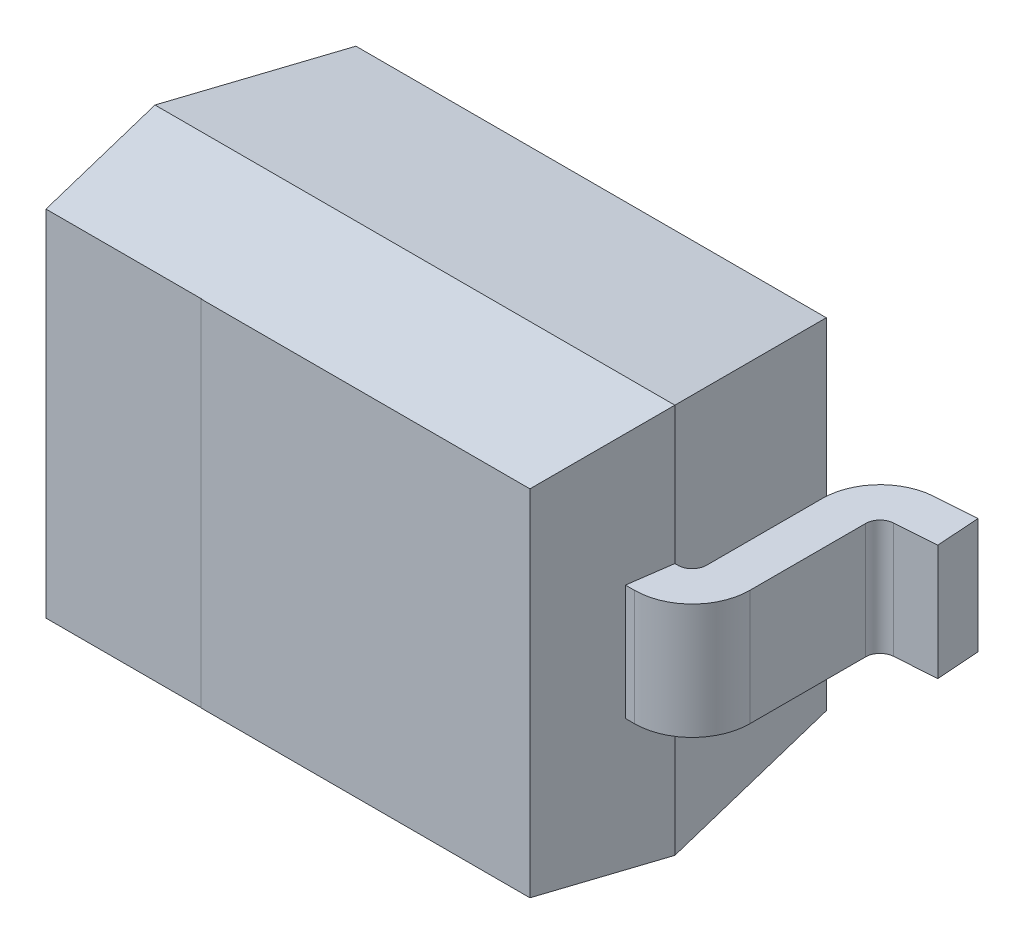
ISO-10303-21;
HEADER;
FILE_DESCRIPTION(('STEP AP214'),'2;1');
FILE_NAME('part.step','',(''),(''),'','','');
FILE_SCHEMA(('AUTOMOTIVE_DESIGN { 1 0 10303 214 1 1 1 1 }'));
ENDSEC;
DATA;
#1=APPLICATION_CONTEXT('core data for automotive mechanical design processes');
#2=APPLICATION_PROTOCOL_DEFINITION('international standard','automotive_design',2000,#1);
#3=PRODUCT_CONTEXT('',#1,'mechanical');
#4=PRODUCT('Part','Part','',(#3));
#5=PRODUCT_RELATED_PRODUCT_CATEGORY('part','',(#4));
#6=PRODUCT_DEFINITION_FORMATION('','',#4);
#7=PRODUCT_DEFINITION_CONTEXT('part definition',#1,'design');
#8=PRODUCT_DEFINITION('design','',#6,#7);
#9=PRODUCT_DEFINITION_SHAPE('','',#8);
#10=(LENGTH_UNIT() NAMED_UNIT(*) SI_UNIT(.MILLI.,.METRE.));
#11=(NAMED_UNIT(*) PLANE_ANGLE_UNIT() SI_UNIT($,.RADIAN.));
#12=(NAMED_UNIT(*) SI_UNIT($,.STERADIAN.) SOLID_ANGLE_UNIT());
#13=UNCERTAINTY_MEASURE_WITH_UNIT(LENGTH_MEASURE(1.E-05),#10,'distance_accuracy_value','');
#14=(GEOMETRIC_REPRESENTATION_CONTEXT(3) GLOBAL_UNCERTAINTY_ASSIGNED_CONTEXT((#13)) GLOBAL_UNIT_ASSIGNED_CONTEXT((#10,
#11,#12)) REPRESENTATION_CONTEXT('',''));
#15=CARTESIAN_POINT('',(0.,0.,0.));
#16=DIRECTION('',(0.,0.,1.));
#17=DIRECTION('',(1.,0.,0.));
#18=AXIS2_PLACEMENT_3D('',#15,#16,#17);
#19=CARTESIAN_POINT('',(0.838162032730946,2.5,1.1));
#20=DIRECTION('',(-0.99026806874157,0.,-0.139173100960069));
#21=DIRECTION('',(-0.139173100960069,0.,0.99026806874157));
#22=AXIS2_PLACEMENT_3D('',#19,#20,#21);
#23=PLANE('',#22);
#24=DIRECTION('',(0.139173100960069,0.,-0.99026806874157));
#25=VECTOR('',#24,1.);
#26=CARTESIAN_POINT('',(0.878918874794641,0.2,0.81));
#27=LINE('',#26,#25);
#28=CARTESIAN_POINT('',(0.878918874794641,0.2,0.81));
#29=VERTEX_POINT('',#28);
#30=CARTESIAN_POINT('',(0.9,0.2,0.66));
#31=VERTEX_POINT('',#30);
#32=EDGE_CURVE('E520',#29,#31,#27,.T.);
#33=ORIENTED_EDGE('',*,*,#32,.T.);
#34=DIRECTION('',(0.,-1.,0.));
#35=VECTOR('',#34,1.);
#36=CARTESIAN_POINT('',(0.9,2.5,0.66));
#37=LINE('',#36,#35);
#38=CARTESIAN_POINT('',(0.9,0.675,0.66));
#39=VERTEX_POINT('',#38);
#40=EDGE_CURVE('E310',#39,#31,#37,.T.);
#41=ORIENTED_EDGE('',*,*,#40,.F.);
#42=DIRECTION('',(0.137844537491632,0.137844537491632,-0.980814848463988));
#43=VECTOR('',#42,1.);
#44=CARTESIAN_POINT('',(0.87401406079437,0.64901406079437,0.844899565031451));
#45=LINE('',#44,#43);
#46=CARTESIAN_POINT('',(0.838162032730946,0.613162032730946,1.1));
#47=VERTEX_POINT('',#46);
#48=EDGE_CURVE('E333',#47,#39,#45,.T.);
#49=ORIENTED_EDGE('',*,*,#48,.F.);
#50=DIRECTION('',(0.,-1.,0.));
#51=VECTOR('',#50,1.);
#52=CARTESIAN_POINT('',(0.838162032730946,2.5,1.1));
#53=LINE('',#52,#51);
#54=CARTESIAN_POINT('',(0.838162032730946,-0.613162032730946,1.1));
#55=VERTEX_POINT('',#54);
#56=EDGE_CURVE('E314',#47,#55,#53,.T.);
#57=ORIENTED_EDGE('',*,*,#56,.T.);
#58=DIRECTION('',(-0.137844537491632,0.137844537491632,0.980814848463988));
#59=VECTOR('',#58,1.);
#60=CARTESIAN_POINT('',(0.77900847821296,-0.55400847821296,1.52089941078867));
#61=LINE('',#60,#59);
#62=CARTESIAN_POINT('',(0.9,-0.675,0.66));
#63=VERTEX_POINT('',#62);
#64=EDGE_CURVE('E270',#63,#55,#61,.T.);
#65=ORIENTED_EDGE('',*,*,#64,.F.);
#66=CARTESIAN_POINT('',(0.9,-0.2,0.66));
#67=VERTEX_POINT('',#66);
#68=EDGE_CURVE('E309',#67,#63,#37,.T.);
#69=ORIENTED_EDGE('',*,*,#68,.F.);
#70=DIRECTION('',(0.139173100960069,0.,-0.99026806874157));
#71=VECTOR('',#70,1.);
#72=CARTESIAN_POINT('',(0.878918874794641,-0.2,0.81));
#73=LINE('',#72,#71);
#74=CARTESIAN_POINT('',(0.878918874794641,-0.2,0.81));
#75=VERTEX_POINT('',#74);
#76=EDGE_CURVE('E63',#75,#67,#73,.T.);
#77=ORIENTED_EDGE('',*,*,#76,.F.);
#78=DIRECTION('',(0.,-1.,0.));
#79=VECTOR('',#78,1.);
#80=CARTESIAN_POINT('',(0.878918874794641,0.2,0.81));
#81=LINE('',#80,#79);
#82=EDGE_CURVE('E517',#29,#75,#81,.T.);
#83=ORIENTED_EDGE('',*,*,#82,.F.);
#84=EDGE_LOOP('',(#33,#41,#49,#57,#65,#69,#77,#83));
#85=FACE_BOUND('',#84,.T.);
#86=ADVANCED_FACE('F39',(#85),#23,.F.);
#87=CARTESIAN_POINT('',(-0.9,2.5,0.66));
#88=DIRECTION('',(0.99026806874157,0.,-0.139173100960069));
#89=DIRECTION('',(-0.139173100960069,0.,-0.99026806874157));
#90=AXIS2_PLACEMENT_3D('',#87,#88,#89);
#91=PLANE('',#90);
#92=DIRECTION('',(-0.137844537491632,-0.137844537491632,-0.980814848463988));
#93=VECTOR('',#92,1.);
#94=CARTESIAN_POINT('',(-0.839671455060805,-0.614671455060804,1.08925990205583));
#95=LINE('',#94,#93);
#96=CARTESIAN_POINT('',(-0.838302573565649,-0.613302573565648,1.099));
#97=VERTEX_POINT('',#96);
#98=CARTESIAN_POINT('',(-0.9,-0.675,0.66));
#99=VERTEX_POINT('',#98);
#100=EDGE_CURVE('E302',#97,#99,#95,.T.);
#101=ORIENTED_EDGE('',*,*,#100,.F.);
#102=DIRECTION('',(0.,1.,0.));
#103=VECTOR('',#102,1.);
#104=CARTESIAN_POINT('',(-0.838302573565648,2.5,1.099));
#105=LINE('',#104,#103);
#106=CARTESIAN_POINT('',(-0.838302573565648,0.613302573565648,1.099));
#107=VERTEX_POINT('',#106);
#108=EDGE_CURVE('E55',#97,#107,#105,.T.);
#109=ORIENTED_EDGE('',*,*,#108,.T.);
#110=DIRECTION('',(0.137844537491632,-0.137844537491632,0.980814848463988));
#111=VECTOR('',#110,1.);
#112=CARTESIAN_POINT('',(-0.934677037642215,0.709677037642215,0.413260056298615));
#113=LINE('',#112,#111);
#114=CARTESIAN_POINT('',(-0.9,0.675,0.66));
#115=VERTEX_POINT('',#114);
#116=EDGE_CURVE('E298',#115,#107,#113,.T.);
#117=ORIENTED_EDGE('',*,*,#116,.F.);
#118=DIRECTION('',(0.,-1.,0.));
#119=VECTOR('',#118,1.);
#120=CARTESIAN_POINT('',(-0.9,2.5,0.66));
#121=LINE('',#120,#119);
#122=CARTESIAN_POINT('',(-0.9,0.2,0.66));
#123=VERTEX_POINT('',#122);
#124=EDGE_CURVE('E318',#115,#123,#121,.T.);
#125=ORIENTED_EDGE('',*,*,#124,.T.);
#126=DIRECTION('',(-0.139173100960069,0.,-0.99026806874157));
#127=VECTOR('',#126,1.);
#128=CARTESIAN_POINT('',(-0.878918874794641,0.2,0.81));
#129=LINE('',#128,#127);
#130=CARTESIAN_POINT('',(-0.878918874794641,0.2,0.81));
#131=VERTEX_POINT('',#130);
#132=EDGE_CURVE('E480',#131,#123,#129,.T.);
#133=ORIENTED_EDGE('',*,*,#132,.F.);
#134=DIRECTION('',(0.,-1.,0.));
#135=VECTOR('',#134,1.);
#136=CARTESIAN_POINT('',(-0.878918874794641,0.2,0.81));
#137=LINE('',#136,#135);
#138=CARTESIAN_POINT('',(-0.878918874794641,-0.2,0.81));
#139=VERTEX_POINT('',#138);
#140=EDGE_CURVE('E291',#131,#139,#137,.T.);
#141=ORIENTED_EDGE('',*,*,#140,.T.);
#142=DIRECTION('',(-0.139173100960069,0.,-0.99026806874157));
#143=VECTOR('',#142,1.);
#144=CARTESIAN_POINT('',(-0.878918874794641,-0.2,0.81));
#145=LINE('',#144,#143);
#146=CARTESIAN_POINT('',(-0.9,-0.2,0.66));
#147=VERTEX_POINT('',#146);
#148=EDGE_CURVE('E352',#139,#147,#145,.T.);
#149=ORIENTED_EDGE('',*,*,#148,.T.);
#150=EDGE_CURVE('E317',#147,#99,#121,.T.);
#151=ORIENTED_EDGE('',*,*,#150,.T.);
#152=EDGE_LOOP('',(#101,#109,#117,#125,#133,#141,#149,#151));
#153=FACE_BOUND('',#152,.T.);
#154=ADVANCED_FACE('F346',(#153),#91,.F.);
#155=CARTESIAN_POINT('',(0.814270090831543,2.5,0.0500000000000002));
#156=DIRECTION('',(0.,0.,1.));
#157=DIRECTION('',(1.,0.,0.));
#158=AXIS2_PLACEMENT_3D('',#155,#156,#157);
#159=PLANE('',#158);
#160=DIRECTION('',(1.,0.,0.));
#161=VECTOR('',#160,1.);
#162=CARTESIAN_POINT('',(-0.9,-0.589270090831543,0.0500000000000002));
#163=LINE('',#162,#161);
#164=CARTESIAN_POINT('',(-0.814270090831543,-0.589270090831544,0.0500000000000002));
#165=VERTEX_POINT('',#164);
#166=CARTESIAN_POINT('',(0.814270090831543,-0.589270090831544,0.0500000000000002));
#167=VERTEX_POINT('',#166);
#168=EDGE_CURVE('E278',#165,#167,#163,.T.);
#169=ORIENTED_EDGE('',*,*,#168,.F.);
#170=DIRECTION('',(0.,-1.,0.));
#171=VECTOR('',#170,1.);
#172=CARTESIAN_POINT('',(-0.814270090831543,2.5,0.0500000000000002));
#173=LINE('',#172,#171);
#174=CARTESIAN_POINT('',(-0.814270090831543,0.589270090831543,0.0500000000000002));
#175=VERTEX_POINT('',#174);
#176=EDGE_CURVE('E322',#175,#165,#173,.T.);
#177=ORIENTED_EDGE('',*,*,#176,.F.);
#178=DIRECTION('',(1.,0.,0.));
#179=VECTOR('',#178,1.);
#180=CARTESIAN_POINT('',(-0.9,0.589270090831543,0.0500000000000002));
#181=LINE('',#180,#179);
#182=CARTESIAN_POINT('',(0.814270090831543,0.589270090831543,0.0500000000000002));
#183=VERTEX_POINT('',#182);
#184=EDGE_CURVE('E287',#175,#183,#181,.T.);
#185=ORIENTED_EDGE('',*,*,#184,.T.);
#186=DIRECTION('',(0.,-1.,0.));
#187=VECTOR('',#186,1.);
#188=CARTESIAN_POINT('',(0.814270090831543,2.5,0.0500000000000002));
#189=LINE('',#188,#187);
#190=EDGE_CURVE('E305',#183,#167,#189,.T.);
#191=ORIENTED_EDGE('',*,*,#190,.T.);
#192=EDGE_LOOP('',(#169,#177,#185,#191));
#193=FACE_BOUND('',#192,.T.);
#194=ADVANCED_FACE('F41',(#193),#159,.F.);
#195=CARTESIAN_POINT('',(-0.814270090831543,2.5,0.0500000000000002));
#196=DIRECTION('',(0.990268068741571,0.,0.139173100960062));
#197=DIRECTION('',(0.139173100960062,0.,-0.990268068741571));
#198=AXIS2_PLACEMENT_3D('',#195,#196,#197);
#199=PLANE('',#198);
#200=DIRECTION('',(0.137844537491625,0.137844537491625,-0.98081484846399));
#201=VECTOR('',#200,1.);
#202=CARTESIAN_POINT('',(-0.755570509885394,-0.530570509885394,-0.367669220980882));
#203=LINE('',#202,#201);
#204=EDGE_CURVE('E295',#99,#165,#203,.T.);
#205=ORIENTED_EDGE('',*,*,#204,.F.);
#206=ORIENTED_EDGE('',*,*,#150,.F.);
#207=DIRECTION('',(0.,-1.,0.));
#208=VECTOR('',#207,1.);
#209=CARTESIAN_POINT('',(-0.9,0.2,0.66));
#210=LINE('',#209,#208);
#211=EDGE_CURVE('E372',#123,#147,#210,.T.);
#212=ORIENTED_EDGE('',*,*,#211,.F.);
#213=ORIENTED_EDGE('',*,*,#124,.F.);
#214=DIRECTION('',(-0.137844537491625,0.137844537491625,0.98081484846399));
#215=VECTOR('',#214,1.);
#216=CARTESIAN_POINT('',(-0.850576092466794,0.625576092466795,0.308330624776304));
#217=LINE('',#216,#215);
#218=EDGE_CURVE('E292',#175,#115,#217,.T.);
#219=ORIENTED_EDGE('',*,*,#218,.F.);
#220=ORIENTED_EDGE('',*,*,#176,.T.);
#221=EDGE_LOOP('',(#205,#206,#212,#213,#219,#220));
#222=FACE_BOUND('',#221,.T.);
#223=ADVANCED_FACE('F361',(#222),#199,.F.);
#224=CARTESIAN_POINT('',(-0.838162032730946,2.5,1.1));
#225=DIRECTION('',(0.,0.,-1.));
#226=DIRECTION('',(-1.,0.,0.));
#227=AXIS2_PLACEMENT_3D('',#224,#225,#226);
#228=PLANE('',#227);
#229=DIRECTION('',(1.,0.,0.));
#230=VECTOR('',#229,1.);
#231=CARTESIAN_POINT('',(-0.9,0.613162032730946,1.1));
#232=LINE('',#231,#230);
#233=CARTESIAN_POINT('',(-0.3,0.613162032730946,1.1));
#234=VERTEX_POINT('',#233);
#235=EDGE_CURVE('E264',#234,#47,#232,.T.);
#236=ORIENTED_EDGE('',*,*,#235,.F.);
#237=DIRECTION('',(0.,1.,0.));
#238=VECTOR('',#237,1.);
#239=CARTESIAN_POINT('',(-0.3,0.675,1.1));
#240=LINE('',#239,#238);
#241=CARTESIAN_POINT('',(-0.3,-0.613162032730946,1.1));
#242=VERTEX_POINT('',#241);
#243=EDGE_CURVE('E252',#242,#234,#240,.T.);
#244=ORIENTED_EDGE('',*,*,#243,.F.);
#245=DIRECTION('',(1.,0.,0.));
#246=VECTOR('',#245,1.);
#247=CARTESIAN_POINT('',(-0.9,-0.613162032730946,1.1));
#248=LINE('',#247,#246);
#249=EDGE_CURVE('E262',#242,#55,#248,.T.);
#250=ORIENTED_EDGE('',*,*,#249,.T.);
#251=ORIENTED_EDGE('',*,*,#56,.F.);
#252=EDGE_LOOP('',(#236,#244,#250,#251));
#253=FACE_BOUND('',#252,.T.);
#254=ADVANCED_FACE('F260',(#253),#228,.F.);
#255=CARTESIAN_POINT('',(0.9,2.5,0.66));
#256=DIRECTION('',(-0.990268068741571,0.,0.139173100960062));
#257=DIRECTION('',(0.139173100960062,0.,0.990268068741571));
#258=AXIS2_PLACEMENT_3D('',#255,#256,#257);
#259=PLANE('',#258);
#260=DIRECTION('',(0.137844537491625,-0.137844537491625,0.98081484846399));
#261=VECTOR('',#260,1.);
#262=CARTESIAN_POINT('',(0.839671455060811,-0.614671455060811,0.230740097944187));
#263=LINE('',#262,#261);
#264=EDGE_CURVE('E329',#167,#63,#263,.T.);
#265=ORIENTED_EDGE('',*,*,#264,.F.);
#266=ORIENTED_EDGE('',*,*,#190,.F.);
#267=DIRECTION('',(-0.137844537491625,-0.137844537491625,-0.98081484846399));
#268=VECTOR('',#267,1.);
#269=CARTESIAN_POINT('',(0.934677037642211,0.709677037642211,0.906739943701373));
#270=LINE('',#269,#268);
#271=EDGE_CURVE('E326',#39,#183,#270,.T.);
#272=ORIENTED_EDGE('',*,*,#271,.F.);
#273=ORIENTED_EDGE('',*,*,#40,.T.);
#274=DIRECTION('',(0.,-1.,0.));
#275=VECTOR('',#274,1.);
#276=CARTESIAN_POINT('',(0.9,0.2,0.66));
#277=LINE('',#276,#275);
#278=EDGE_CURVE('E513',#31,#67,#277,.T.);
#279=ORIENTED_EDGE('',*,*,#278,.T.);
#280=ORIENTED_EDGE('',*,*,#68,.T.);
#281=EDGE_LOOP('',(#265,#266,#272,#273,#279,#280));
#282=FACE_BOUND('',#281,.T.);
#283=ADVANCED_FACE('F700',(#282),#259,.F.);
#284=CARTESIAN_POINT('',(-0.9,0.675,0.66));
#285=DIRECTION('',(0.,0.990268068741571,-0.139173100960062));
#286=DIRECTION('',(0.,0.139173100960062,0.990268068741571));
#287=AXIS2_PLACEMENT_3D('',#284,#285,#286);
#288=PLANE('',#287);
#289=ORIENTED_EDGE('',*,*,#218,.T.);
#290=DIRECTION('',(1.,0.,0.));
#291=VECTOR('',#290,1.);
#292=CARTESIAN_POINT('',(-0.9,0.675,0.66));
#293=LINE('',#292,#291);
#294=EDGE_CURVE('E281',#115,#39,#293,.T.);
#295=ORIENTED_EDGE('',*,*,#294,.T.);
#296=ORIENTED_EDGE('',*,*,#271,.T.);
#297=ORIENTED_EDGE('',*,*,#184,.F.);
#298=EDGE_LOOP('',(#289,#295,#296,#297));
#299=FACE_BOUND('',#298,.T.);
#300=ADVANCED_FACE('F734',(#299),#288,.T.);
#301=CARTESIAN_POINT('',(-0.9,0.613162032730946,1.1));
#302=DIRECTION('',(0.,0.99026806874157,0.139173100960069));
#303=DIRECTION('',(0.,-0.139173100960069,0.99026806874157));
#304=AXIS2_PLACEMENT_3D('',#301,#302,#303);
#305=PLANE('',#304);
#306=DIRECTION('',(0.,0.139173100960069,-0.99026806874157));
#307=VECTOR('',#306,1.);
#308=CARTESIAN_POINT('',(-0.3,0.613162032730946,1.1));
#309=LINE('',#308,#307);
#310=CARTESIAN_POINT('',(-0.3,0.613302573565648,1.099));
#311=VERTEX_POINT('',#310);
#312=EDGE_CURVE('E566',#234,#311,#309,.T.);
#313=ORIENTED_EDGE('',*,*,#312,.F.);
#314=ORIENTED_EDGE('',*,*,#235,.T.);
#315=ORIENTED_EDGE('',*,*,#48,.T.);
#316=ORIENTED_EDGE('',*,*,#294,.F.);
#317=ORIENTED_EDGE('',*,*,#116,.T.);
#318=DIRECTION('',(-1.,0.,0.));
#319=VECTOR('',#318,1.);
#320=CARTESIAN_POINT('',(-0.9,0.613302573565648,1.099));
#321=LINE('',#320,#319);
#322=EDGE_CURVE('E614',#311,#107,#321,.T.);
#323=ORIENTED_EDGE('',*,*,#322,.F.);
#324=EDGE_LOOP('',(#313,#314,#315,#316,#317,#323));
#325=FACE_BOUND('',#324,.T.);
#326=ADVANCED_FACE('F621',(#325),#305,.T.);
#327=CARTESIAN_POINT('',(-0.9,-0.675,0.66));
#328=DIRECTION('',(0.,-0.99026806874157,0.139173100960069));
#329=DIRECTION('',(0.,-0.139173100960069,-0.99026806874157));
#330=AXIS2_PLACEMENT_3D('',#327,#328,#329);
#331=PLANE('',#330);
#332=DIRECTION('',(0.,0.139173100960069,0.99026806874157));
#333=VECTOR('',#332,1.);
#334=CARTESIAN_POINT('',(-0.3,-0.675,0.66));
#335=LINE('',#334,#333);
#336=CARTESIAN_POINT('',(-0.3,-0.613302573565648,1.099));
#337=VERTEX_POINT('',#336);
#338=EDGE_CURVE('E12',#337,#242,#335,.T.);
#339=ORIENTED_EDGE('',*,*,#338,.F.);
#340=DIRECTION('',(1.,0.,0.));
#341=VECTOR('',#340,1.);
#342=CARTESIAN_POINT('',(-0.9,-0.613302573565648,1.099));
#343=LINE('',#342,#341);
#344=EDGE_CURVE('E48',#97,#337,#343,.T.);
#345=ORIENTED_EDGE('',*,*,#344,.F.);
#346=ORIENTED_EDGE('',*,*,#100,.T.);
#347=DIRECTION('',(1.,0.,0.));
#348=VECTOR('',#347,1.);
#349=CARTESIAN_POINT('',(-0.9,-0.675,0.66));
#350=LINE('',#349,#348);
#351=EDGE_CURVE('E273',#99,#63,#350,.T.);
#352=ORIENTED_EDGE('',*,*,#351,.T.);
#353=ORIENTED_EDGE('',*,*,#64,.T.);
#354=ORIENTED_EDGE('',*,*,#249,.F.);
#355=EDGE_LOOP('',(#339,#345,#346,#352,#353,#354));
#356=FACE_BOUND('',#355,.T.);
#357=ADVANCED_FACE('F267',(#356),#331,.T.);
#358=CARTESIAN_POINT('',(-0.9,-0.589270090831543,0.0500000000000002));
#359=DIRECTION('',(0.,-0.990268068741571,-0.139173100960062));
#360=DIRECTION('',(0.,0.139173100960062,-0.990268068741571));
#361=AXIS2_PLACEMENT_3D('',#358,#359,#360);
#362=PLANE('',#361);
#363=ORIENTED_EDGE('',*,*,#204,.T.);
#364=ORIENTED_EDGE('',*,*,#168,.T.);
#365=ORIENTED_EDGE('',*,*,#264,.T.);
#366=ORIENTED_EDGE('',*,*,#351,.F.);
#367=EDGE_LOOP('',(#363,#364,#365,#366));
#368=FACE_BOUND('',#367,.T.);
#369=ADVANCED_FACE('F358',(#368),#362,.T.);
#370=CARTESIAN_POINT('',(-0.91,0.2,0.81));
#371=DIRECTION('',(0.,0.,-1.));
#372=DIRECTION('',(-1.,0.,0.));
#373=AXIS2_PLACEMENT_3D('',#370,#371,#372);
#374=PLANE('',#373);
#375=DIRECTION('',(1.,0.,0.));
#376=VECTOR('',#375,1.);
#377=CARTESIAN_POINT('',(-0.91,-0.2,0.81));
#378=LINE('',#377,#376);
#379=CARTESIAN_POINT('',(-0.91,-0.2,0.81));
#380=VERTEX_POINT('',#379);
#381=EDGE_CURVE('E448',#380,#139,#378,.T.);
#382=ORIENTED_EDGE('',*,*,#381,.T.);
#383=ORIENTED_EDGE('',*,*,#140,.F.);
#384=DIRECTION('',(1.,0.,0.));
#385=VECTOR('',#384,1.);
#386=CARTESIAN_POINT('',(-0.91,0.2,0.81));
#387=LINE('',#386,#385);
#388=CARTESIAN_POINT('',(-0.91,0.2,0.81));
#389=VERTEX_POINT('',#388);
#390=EDGE_CURVE('E418',#389,#131,#387,.T.);
#391=ORIENTED_EDGE('',*,*,#390,.F.);
#392=DIRECTION('',(0.,-1.,0.));
#393=VECTOR('',#392,1.);
#394=CARTESIAN_POINT('',(-0.91,0.2,0.81));
#395=LINE('',#394,#393);
#396=EDGE_CURVE('E410',#389,#380,#395,.T.);
#397=ORIENTED_EDGE('',*,*,#396,.T.);
#398=EDGE_LOOP('',(#382,#383,#391,#397));
#399=FACE_BOUND('',#398,.T.);
#400=ADVANCED_FACE('F635',(#399),#374,.F.);
#401=CARTESIAN_POINT('',(-0.9,0.2,0.66));
#402=DIRECTION('',(0.,0.,1.));
#403=DIRECTION('',(1.,0.,0.));
#404=AXIS2_PLACEMENT_3D('',#401,#402,#403);
#405=PLANE('',#404);
#406=DIRECTION('',(-1.,0.,0.));
#407=VECTOR('',#406,1.);
#408=CARTESIAN_POINT('',(-0.9,-0.2,0.66));
#409=LINE('',#408,#407);
#410=CARTESIAN_POINT('',(-0.91,-0.2,0.66));
#411=VERTEX_POINT('',#410);
#412=EDGE_CURVE('E443',#147,#411,#409,.T.);
#413=ORIENTED_EDGE('',*,*,#412,.T.);
#414=DIRECTION('',(0.,-1.,0.));
#415=VECTOR('',#414,1.);
#416=CARTESIAN_POINT('',(-0.91,0.2,0.66));
#417=LINE('',#416,#415);
#418=CARTESIAN_POINT('',(-0.91,0.2,0.66));
#419=VERTEX_POINT('',#418);
#420=EDGE_CURVE('E375',#419,#411,#417,.T.);
#421=ORIENTED_EDGE('',*,*,#420,.F.);
#422=DIRECTION('',(-1.,0.,0.));
#423=VECTOR('',#422,1.);
#424=CARTESIAN_POINT('',(-0.9,0.2,0.66));
#425=LINE('',#424,#423);
#426=EDGE_CURVE('E477',#123,#419,#425,.T.);
#427=ORIENTED_EDGE('',*,*,#426,.F.);
#428=ORIENTED_EDGE('',*,*,#211,.T.);
#429=EDGE_LOOP('',(#413,#421,#427,#428));
#430=FACE_BOUND('',#429,.T.);
#431=ADVANCED_FACE('F626',(#430),#405,.F.);
#432=CARTESIAN_POINT('',(-0.91,0.2,0.61));
#433=DIRECTION('',(0.,-1.,0.));
#434=DIRECTION('',(0.,0.,-1.));
#435=AXIS2_PLACEMENT_3D('',#432,#433,#434);
#436=CYLINDRICAL_SURFACE('',#435,0.0499999999999999);
#437=CARTESIAN_POINT('',(-0.91,-0.2,0.61));
#438=DIRECTION('',(0.,-1.,0.));
#439=DIRECTION('',(0.,0.,-1.));
#440=AXIS2_PLACEMENT_3D('',#437,#438,#439);
#441=CIRCLE('',#440,0.0499999999999999);
#442=CARTESIAN_POINT('',(-0.96,-0.2,0.61));
#443=VERTEX_POINT('',#442);
#444=EDGE_CURVE('E440',#411,#443,#441,.T.);
#445=ORIENTED_EDGE('',*,*,#444,.T.);
#446=DIRECTION('',(0.,-1.,0.));
#447=VECTOR('',#446,1.);
#448=CARTESIAN_POINT('',(-0.96,0.2,0.61));
#449=LINE('',#448,#447);
#450=CARTESIAN_POINT('',(-0.96,0.2,0.61));
#451=VERTEX_POINT('',#450);
#452=EDGE_CURVE('E379',#451,#443,#449,.T.);
#453=ORIENTED_EDGE('',*,*,#452,.F.);
#454=CARTESIAN_POINT('',(-0.91,0.2,0.61));
#455=DIRECTION('',(0.,-1.,0.));
#456=DIRECTION('',(0.,0.,-1.));
#457=AXIS2_PLACEMENT_3D('',#454,#455,#456);
#458=CIRCLE('',#457,0.0499999999999999);
#459=EDGE_CURVE('E475',#419,#451,#458,.T.);
#460=ORIENTED_EDGE('',*,*,#459,.F.);
#461=ORIENTED_EDGE('',*,*,#420,.T.);
#462=EDGE_LOOP('',(#445,#453,#460,#461));
#463=FACE_BOUND('',#462,.T.);
#464=ADVANCED_FACE('F646',(#463),#436,.F.);
#465=CARTESIAN_POINT('',(-0.96,0.2,0.61));
#466=DIRECTION('',(-1.,0.,0.));
#467=DIRECTION('',(0.,0.,1.));
#468=AXIS2_PLACEMENT_3D('',#465,#466,#467);
#469=PLANE('',#468);
#470=DIRECTION('',(0.,0.,-1.));
#471=VECTOR('',#470,1.);
#472=CARTESIAN_POINT('',(-0.96,-0.2,0.61));
#473=LINE('',#472,#471);
#474=CARTESIAN_POINT('',(-0.96,-0.2,0.209546456115123));
#475=VERTEX_POINT('',#474);
#476=EDGE_CURVE('E437',#443,#475,#473,.T.);
#477=ORIENTED_EDGE('',*,*,#476,.T.);
#478=DIRECTION('',(0.,-1.,0.));
#479=VECTOR('',#478,1.);
#480=CARTESIAN_POINT('',(-0.96,0.2,0.209546456115123));
#481=LINE('',#480,#479);
#482=CARTESIAN_POINT('',(-0.96,0.2,0.209546456115123));
#483=VERTEX_POINT('',#482);
#484=EDGE_CURVE('E382',#483,#475,#481,.T.);
#485=ORIENTED_EDGE('',*,*,#484,.F.);
#486=DIRECTION('',(0.,0.,-1.));
#487=VECTOR('',#486,1.);
#488=CARTESIAN_POINT('',(-0.96,0.2,0.61));
#489=LINE('',#488,#487);
#490=EDGE_CURVE('E472',#451,#483,#489,.T.);
#491=ORIENTED_EDGE('',*,*,#490,.F.);
#492=ORIENTED_EDGE('',*,*,#452,.T.);
#493=EDGE_LOOP('',(#477,#485,#491,#492));
#494=FACE_BOUND('',#493,.T.);
#495=ADVANCED_FACE('F649',(#494),#469,.F.);
#496=CARTESIAN_POINT('',(-1.16,0.2,0.209546456115123));
#497=DIRECTION('',(0.,-1.,0.));
#498=DIRECTION('',(0.,0.,-1.));
#499=AXIS2_PLACEMENT_3D('',#496,#497,#498);
#500=CYLINDRICAL_SURFACE('',#499,0.2);
#501=CARTESIAN_POINT('',(-1.16,-0.2,0.209546456115123));
#502=DIRECTION('',(0.,1.,0.));
#503=DIRECTION('',(0.,0.,1.));
#504=AXIS2_PLACEMENT_3D('',#501,#502,#503);
#505=CIRCLE('',#504,0.2);
#506=CARTESIAN_POINT('',(-1.14604870525118,-0.2,0.0100336460631575));
#507=VERTEX_POINT('',#506);
#508=EDGE_CURVE('E434',#475,#507,#505,.T.);
#509=ORIENTED_EDGE('',*,*,#508,.T.);
#510=DIRECTION('',(0.,-1.,0.));
#511=VECTOR('',#510,1.);
#512=CARTESIAN_POINT('',(-1.14604870525118,0.2,0.0100336460631575));
#513=LINE('',#512,#511);
#514=CARTESIAN_POINT('',(-1.14604870525118,0.2,0.0100336460631575));
#515=VERTEX_POINT('',#514);
#516=EDGE_CURVE('E386',#515,#507,#513,.T.);
#517=ORIENTED_EDGE('',*,*,#516,.F.);
#518=CARTESIAN_POINT('',(-1.16,0.2,0.209546456115123));
#519=DIRECTION('',(0.,1.,0.));
#520=DIRECTION('',(0.,0.,1.));
#521=AXIS2_PLACEMENT_3D('',#518,#519,#520);
#522=CIRCLE('',#521,0.2);
#523=EDGE_CURVE('E470',#483,#515,#522,.T.);
#524=ORIENTED_EDGE('',*,*,#523,.F.);
#525=ORIENTED_EDGE('',*,*,#484,.T.);
#526=EDGE_LOOP('',(#509,#517,#524,#525));
#527=FACE_BOUND('',#526,.T.);
#528=ADVANCED_FACE('F656',(#527),#500,.T.);
#529=CARTESIAN_POINT('',(-1.14604870525118,0.2,0.0100336460631577));
#530=DIRECTION('',(-0.0697564737441179,0.,0.997564050259825));
#531=DIRECTION('',(0.997564050259825,0.,0.0697564737441179));
#532=AXIS2_PLACEMENT_3D('',#529,#530,#531);
#533=PLANE('',#532);
#534=DIRECTION('',(-0.997564050259825,0.,-0.0697564737441179));
#535=VECTOR('',#534,1.);
#536=CARTESIAN_POINT('',(-1.14604870525118,-0.2,0.0100336460631577));
#537=LINE('',#536,#535);
#538=CARTESIAN_POINT('',(-1.28953652893838,-0.2,0.));
#539=VERTEX_POINT('',#538);
#540=EDGE_CURVE('E431',#507,#539,#537,.T.);
#541=ORIENTED_EDGE('',*,*,#540,.T.);
#542=DIRECTION('',(0.,-1.,0.));
#543=VECTOR('',#542,1.);
#544=CARTESIAN_POINT('',(-1.28953652893838,0.2,0.));
#545=LINE('',#544,#543);
#546=CARTESIAN_POINT('',(-1.28953652893838,0.2,0.));
#547=VERTEX_POINT('',#546);
#548=EDGE_CURVE('E390',#547,#539,#545,.T.);
#549=ORIENTED_EDGE('',*,*,#548,.F.);
#550=DIRECTION('',(-0.997564050259825,0.,-0.0697564737441179));
#551=VECTOR('',#550,1.);
#552=CARTESIAN_POINT('',(-1.14604870525118,0.2,0.0100336460631577));
#553=LINE('',#552,#551);
#554=EDGE_CURVE('E467',#515,#547,#553,.T.);
#555=ORIENTED_EDGE('',*,*,#554,.F.);
#556=ORIENTED_EDGE('',*,*,#516,.T.);
#557=EDGE_LOOP('',(#541,#549,#555,#556));
#558=FACE_BOUND('',#557,.T.);
#559=ADVANCED_FACE('F659',(#558),#533,.F.);
#560=CARTESIAN_POINT('',(-1.28953652893838,0.2,0.));
#561=DIRECTION('',(0.997564050259825,0.,0.0697564737441167));
#562=DIRECTION('',(0.0697564737441167,0.,-0.997564050259825));
#563=AXIS2_PLACEMENT_3D('',#560,#561,#562);
#564=PLANE('',#563);
#565=DIRECTION('',(-0.0697564737441167,0.,0.997564050259825));
#566=VECTOR('',#565,1.);
#567=CARTESIAN_POINT('',(-1.28953652893838,-0.2,0.));
#568=LINE('',#567,#566);
#569=CARTESIAN_POINT('',(-1.3,-0.2,0.149634607538974));
#570=VERTEX_POINT('',#569);
#571=EDGE_CURVE('E428',#539,#570,#568,.T.);
#572=ORIENTED_EDGE('',*,*,#571,.T.);
#573=DIRECTION('',(0.,-1.,0.));
#574=VECTOR('',#573,1.);
#575=CARTESIAN_POINT('',(-1.3,0.2,0.149634607538974));
#576=LINE('',#575,#574);
#577=CARTESIAN_POINT('',(-1.3,0.2,0.149634607538974));
#578=VERTEX_POINT('',#577);
#579=EDGE_CURVE('E394',#578,#570,#576,.T.);
#580=ORIENTED_EDGE('',*,*,#579,.F.);
#581=DIRECTION('',(-0.0697564737441167,0.,0.997564050259825));
#582=VECTOR('',#581,1.);
#583=CARTESIAN_POINT('',(-1.28953652893838,0.2,0.));
#584=LINE('',#583,#582);
#585=EDGE_CURVE('E464',#547,#578,#584,.T.);
#586=ORIENTED_EDGE('',*,*,#585,.F.);
#587=ORIENTED_EDGE('',*,*,#548,.T.);
#588=EDGE_LOOP('',(#572,#580,#586,#587));
#589=FACE_BOUND('',#588,.T.);
#590=ADVANCED_FACE('F664',(#589),#564,.F.);
#591=CARTESIAN_POINT('',(-1.3,0.2,0.149634607538974));
#592=DIRECTION('',(0.0697564737441178,0.,-0.997564050259825));
#593=DIRECTION('',(-0.997564050259825,0.,-0.0697564737441178));
#594=AXIS2_PLACEMENT_3D('',#591,#592,#593);
#595=PLANE('',#594);
#596=DIRECTION('',(0.997564050259825,0.,0.0697564737441178));
#597=VECTOR('',#596,1.);
#598=CARTESIAN_POINT('',(-1.3,-0.2,0.149634607538974));
#599=LINE('',#598,#597);
#600=CARTESIAN_POINT('',(-1.15651217631279,-0.2,0.159668253602131));
#601=VERTEX_POINT('',#600);
#602=EDGE_CURVE('E425',#570,#601,#599,.T.);
#603=ORIENTED_EDGE('',*,*,#602,.T.);
#604=DIRECTION('',(0.,-1.,0.));
#605=VECTOR('',#604,1.);
#606=CARTESIAN_POINT('',(-1.15651217631279,0.2,0.159668253602131));
#607=LINE('',#606,#605);
#608=CARTESIAN_POINT('',(-1.15651217631279,0.2,0.159668253602131));
#609=VERTEX_POINT('',#608);
#610=EDGE_CURVE('E398',#609,#601,#607,.T.);
#611=ORIENTED_EDGE('',*,*,#610,.F.);
#612=DIRECTION('',(0.997564050259825,0.,0.0697564737441178));
#613=VECTOR('',#612,1.);
#614=CARTESIAN_POINT('',(-1.3,0.2,0.149634607538974));
#615=LINE('',#614,#613);
#616=EDGE_CURVE('E461',#578,#609,#615,.T.);
#617=ORIENTED_EDGE('',*,*,#616,.F.);
#618=ORIENTED_EDGE('',*,*,#579,.T.);
#619=EDGE_LOOP('',(#603,#611,#617,#618));
#620=FACE_BOUND('',#619,.T.);
#621=ADVANCED_FACE('F670',(#620),#595,.F.);
#622=CARTESIAN_POINT('',(-1.16,0.2,0.209546456115123));
#623=DIRECTION('',(0.,-1.,0.));
#624=DIRECTION('',(0.,0.,-1.));
#625=AXIS2_PLACEMENT_3D('',#622,#623,#624);
#626=CYLINDRICAL_SURFACE('',#625,0.0500000000000002);
#627=CARTESIAN_POINT('',(-1.16,-0.2,0.209546456115123));
#628=DIRECTION('',(0.,-1.,0.));
#629=DIRECTION('',(0.,0.,-1.));
#630=AXIS2_PLACEMENT_3D('',#627,#628,#629);
#631=CIRCLE('',#630,0.0500000000000002);
#632=CARTESIAN_POINT('',(-1.11,-0.2,0.209546456115123));
#633=VERTEX_POINT('',#632);
#634=EDGE_CURVE('E422',#601,#633,#631,.T.);
#635=ORIENTED_EDGE('',*,*,#634,.T.);
#636=DIRECTION('',(0.,-1.,0.));
#637=VECTOR('',#636,1.);
#638=CARTESIAN_POINT('',(-1.11,0.2,0.209546456115123));
#639=LINE('',#638,#637);
#640=CARTESIAN_POINT('',(-1.11,0.2,0.209546456115123));
#641=VERTEX_POINT('',#640);
#642=EDGE_CURVE('E402',#641,#633,#639,.T.);
#643=ORIENTED_EDGE('',*,*,#642,.F.);
#644=CARTESIAN_POINT('',(-1.16,0.2,0.209546456115123));
#645=DIRECTION('',(0.,-1.,0.));
#646=DIRECTION('',(0.,0.,-1.));
#647=AXIS2_PLACEMENT_3D('',#644,#645,#646);
#648=CIRCLE('',#647,0.0500000000000002);
#649=EDGE_CURVE('E458',#609,#641,#648,.T.);
#650=ORIENTED_EDGE('',*,*,#649,.F.);
#651=ORIENTED_EDGE('',*,*,#610,.T.);
#652=EDGE_LOOP('',(#635,#643,#650,#651));
#653=FACE_BOUND('',#652,.T.);
#654=ADVANCED_FACE('F674',(#653),#626,.F.);
#655=CARTESIAN_POINT('',(-1.11,0.2,0.209546456115123));
#656=DIRECTION('',(1.,0.,0.));
#657=DIRECTION('',(0.,0.,-1.));
#658=AXIS2_PLACEMENT_3D('',#655,#656,#657);
#659=PLANE('',#658);
#660=DIRECTION('',(0.,0.,1.));
#661=VECTOR('',#660,1.);
#662=CARTESIAN_POINT('',(-1.11,-0.2,0.209546456115123));
#663=LINE('',#662,#661);
#664=CARTESIAN_POINT('',(-1.11,-0.2,0.61));
#665=VERTEX_POINT('',#664);
#666=EDGE_CURVE('E419',#633,#665,#663,.T.);
#667=ORIENTED_EDGE('',*,*,#666,.T.);
#668=DIRECTION('',(0.,-1.,0.));
#669=VECTOR('',#668,1.);
#670=CARTESIAN_POINT('',(-1.11,0.2,0.61));
#671=LINE('',#670,#669);
#672=CARTESIAN_POINT('',(-1.11,0.2,0.61));
#673=VERTEX_POINT('',#672);
#674=EDGE_CURVE('E406',#673,#665,#671,.T.);
#675=ORIENTED_EDGE('',*,*,#674,.F.);
#676=DIRECTION('',(0.,0.,1.));
#677=VECTOR('',#676,1.);
#678=CARTESIAN_POINT('',(-1.11,0.2,0.209546456115123));
#679=LINE('',#678,#677);
#680=EDGE_CURVE('E455',#641,#673,#679,.T.);
#681=ORIENTED_EDGE('',*,*,#680,.F.);
#682=ORIENTED_EDGE('',*,*,#642,.T.);
#683=EDGE_LOOP('',(#667,#675,#681,#682));
#684=FACE_BOUND('',#683,.T.);
#685=ADVANCED_FACE('F678',(#684),#659,.F.);
#686=CARTESIAN_POINT('',(-0.91,0.2,0.61));
#687=DIRECTION('',(0.,-1.,0.));
#688=DIRECTION('',(0.,0.,-1.));
#689=AXIS2_PLACEMENT_3D('',#686,#687,#688);
#690=CYLINDRICAL_SURFACE('',#689,0.2);
#691=CARTESIAN_POINT('',(-0.91,-0.2,0.61));
#692=DIRECTION('',(0.,1.,0.));
#693=DIRECTION('',(0.,0.,1.));
#694=AXIS2_PLACEMENT_3D('',#691,#692,#693);
#695=CIRCLE('',#694,0.2);
#696=EDGE_CURVE('E415',#665,#380,#695,.T.);
#697=ORIENTED_EDGE('',*,*,#696,.T.);
#698=ORIENTED_EDGE('',*,*,#396,.F.);
#699=CARTESIAN_POINT('',(-0.91,0.2,0.61));
#700=DIRECTION('',(0.,1.,0.));
#701=DIRECTION('',(0.,0.,1.));
#702=AXIS2_PLACEMENT_3D('',#699,#700,#701);
#703=CIRCLE('',#702,0.2);
#704=EDGE_CURVE('E414',#673,#389,#703,.T.);
#705=ORIENTED_EDGE('',*,*,#704,.F.);
#706=ORIENTED_EDGE('',*,*,#674,.T.);
#707=EDGE_LOOP('',(#697,#698,#705,#706));
#708=FACE_BOUND('',#707,.T.);
#709=ADVANCED_FACE('F681',(#708),#690,.T.);
#710=CARTESIAN_POINT('',(-0.91,0.2,0.61));
#711=DIRECTION('',(0.,-1.,0.));
#712=DIRECTION('',(0.,0.,-1.));
#713=AXIS2_PLACEMENT_3D('',#710,#711,#712);
#714=PLANE('',#713);
#715=ORIENTED_EDGE('',*,*,#390,.T.);
#716=ORIENTED_EDGE('',*,*,#132,.T.);
#717=ORIENTED_EDGE('',*,*,#426,.T.);
#718=ORIENTED_EDGE('',*,*,#459,.T.);
#719=ORIENTED_EDGE('',*,*,#490,.T.);
#720=ORIENTED_EDGE('',*,*,#523,.T.);
#721=ORIENTED_EDGE('',*,*,#554,.T.);
#722=ORIENTED_EDGE('',*,*,#585,.T.);
#723=ORIENTED_EDGE('',*,*,#616,.T.);
#724=ORIENTED_EDGE('',*,*,#649,.T.);
#725=ORIENTED_EDGE('',*,*,#680,.T.);
#726=ORIENTED_EDGE('',*,*,#704,.T.);
#727=EDGE_LOOP('',(#715,#716,#717,#718,#719,#720,#721,#722,#723,#724,#725,#726));
#728=FACE_BOUND('',#727,.T.);
#729=ADVANCED_FACE('F630',(#728),#714,.F.);
#730=CARTESIAN_POINT('',(-0.91,-0.2,0.61));
#731=DIRECTION('',(0.,-1.,0.));
#732=DIRECTION('',(0.,0.,-1.));
#733=AXIS2_PLACEMENT_3D('',#730,#731,#732);
#734=PLANE('',#733);
#735=ORIENTED_EDGE('',*,*,#381,.F.);
#736=ORIENTED_EDGE('',*,*,#696,.F.);
#737=ORIENTED_EDGE('',*,*,#666,.F.);
#738=ORIENTED_EDGE('',*,*,#634,.F.);
#739=ORIENTED_EDGE('',*,*,#602,.F.);
#740=ORIENTED_EDGE('',*,*,#571,.F.);
#741=ORIENTED_EDGE('',*,*,#540,.F.);
#742=ORIENTED_EDGE('',*,*,#508,.F.);
#743=ORIENTED_EDGE('',*,*,#476,.F.);
#744=ORIENTED_EDGE('',*,*,#444,.F.);
#745=ORIENTED_EDGE('',*,*,#412,.F.);
#746=ORIENTED_EDGE('',*,*,#148,.F.);
#747=EDGE_LOOP('',(#735,#736,#737,#738,#739,#740,#741,#742,#743,#744,#745,#746));
#748=FACE_BOUND('',#747,.T.);
#749=ADVANCED_FACE('F640',(#748),#734,.T.);
#750=CARTESIAN_POINT('',(0.91,0.2,0.81));
#751=DIRECTION('',(0.,0.,1.));
#752=DIRECTION('',(1.,0.,0.));
#753=AXIS2_PLACEMENT_3D('',#750,#751,#752);
#754=PLANE('',#753);
#755=DIRECTION('',(-1.,0.,0.));
#756=VECTOR('',#755,1.);
#757=CARTESIAN_POINT('',(0.91,-0.2,0.81));
#758=LINE('',#757,#756);
#759=CARTESIAN_POINT('',(0.91,-0.2,0.81));
#760=VERTEX_POINT('',#759);
#761=EDGE_CURVE('E563',#760,#75,#758,.T.);
#762=ORIENTED_EDGE('',*,*,#761,.F.);
#763=DIRECTION('',(0.,-1.,0.));
#764=VECTOR('',#763,1.);
#765=CARTESIAN_POINT('',(0.91,0.2,0.81));
#766=LINE('',#765,#764);
#767=CARTESIAN_POINT('',(0.91,0.2,0.81));
#768=VERTEX_POINT('',#767);
#769=EDGE_CURVE('E452',#768,#760,#766,.T.);
#770=ORIENTED_EDGE('',*,*,#769,.F.);
#771=DIRECTION('',(-1.,0.,0.));
#772=VECTOR('',#771,1.);
#773=CARTESIAN_POINT('',(0.91,0.2,0.81));
#774=LINE('',#773,#772);
#775=EDGE_CURVE('E523',#768,#29,#774,.T.);
#776=ORIENTED_EDGE('',*,*,#775,.T.);
#777=ORIENTED_EDGE('',*,*,#82,.T.);
#778=EDGE_LOOP('',(#762,#770,#776,#777));
#779=FACE_BOUND('',#778,.T.);
#780=ADVANCED_FACE('F741',(#779),#754,.T.);
#781=CARTESIAN_POINT('',(0.91,0.2,0.61));
#782=DIRECTION('',(0.,-1.,0.));
#783=DIRECTION('',(0.,0.,-1.));
#784=AXIS2_PLACEMENT_3D('',#781,#782,#783);
#785=CYLINDRICAL_SURFACE('',#784,0.2);
#786=CARTESIAN_POINT('',(0.91,-0.2,0.61));
#787=DIRECTION('',(0.,-1.,0.));
#788=DIRECTION('',(0.,0.,1.));
#789=AXIS2_PLACEMENT_3D('',#786,#787,#788);
#790=CIRCLE('',#789,0.2);
#791=CARTESIAN_POINT('',(1.11,-0.2,0.61));
#792=VERTEX_POINT('',#791);
#793=EDGE_CURVE('E559',#792,#760,#790,.T.);
#794=ORIENTED_EDGE('',*,*,#793,.F.);
#795=DIRECTION('',(0.,-1.,0.));
#796=VECTOR('',#795,1.);
#797=CARTESIAN_POINT('',(1.11,0.2,0.61));
#798=LINE('',#797,#796);
#799=CARTESIAN_POINT('',(1.11,0.2,0.61));
#800=VERTEX_POINT('',#799);
#801=EDGE_CURVE('E486',#800,#792,#798,.T.);
#802=ORIENTED_EDGE('',*,*,#801,.F.);
#803=CARTESIAN_POINT('',(0.91,0.2,0.61));
#804=DIRECTION('',(0.,-1.,0.));
#805=DIRECTION('',(0.,0.,1.));
#806=AXIS2_PLACEMENT_3D('',#803,#804,#805);
#807=CIRCLE('',#806,0.2);
#808=EDGE_CURVE('E606',#800,#768,#807,.T.);
#809=ORIENTED_EDGE('',*,*,#808,.T.);
#810=ORIENTED_EDGE('',*,*,#769,.T.);
#811=EDGE_LOOP('',(#794,#802,#809,#810));
#812=FACE_BOUND('',#811,.T.);
#813=ADVANCED_FACE('F746',(#812),#785,.T.);
#814=CARTESIAN_POINT('',(1.11,0.2,0.209546456115123));
#815=DIRECTION('',(1.,0.,0.));
#816=DIRECTION('',(0.,0.,-1.));
#817=AXIS2_PLACEMENT_3D('',#814,#815,#816);
#818=PLANE('',#817);
#819=DIRECTION('',(0.,0.,1.));
#820=VECTOR('',#819,1.);
#821=CARTESIAN_POINT('',(1.11,-0.2,0.209546456115123));
#822=LINE('',#821,#820);
#823=CARTESIAN_POINT('',(1.11,-0.2,0.209546456115123));
#824=VERTEX_POINT('',#823);
#825=EDGE_CURVE('E555',#824,#792,#822,.T.);
#826=ORIENTED_EDGE('',*,*,#825,.F.);
#827=DIRECTION('',(0.,-1.,0.));
#828=VECTOR('',#827,1.);
#829=CARTESIAN_POINT('',(1.11,0.2,0.209546456115123));
#830=LINE('',#829,#828);
#831=CARTESIAN_POINT('',(1.11,0.2,0.209546456115123));
#832=VERTEX_POINT('',#831);
#833=EDGE_CURVE('E489',#832,#824,#830,.T.);
#834=ORIENTED_EDGE('',*,*,#833,.F.);
#835=DIRECTION('',(0.,0.,1.));
#836=VECTOR('',#835,1.);
#837=CARTESIAN_POINT('',(1.11,0.2,0.209546456115123));
#838=LINE('',#837,#836);
#839=EDGE_CURVE('E602',#832,#800,#838,.T.);
#840=ORIENTED_EDGE('',*,*,#839,.T.);
#841=ORIENTED_EDGE('',*,*,#801,.T.);
#842=EDGE_LOOP('',(#826,#834,#840,#841));
#843=FACE_BOUND('',#842,.T.);
#844=ADVANCED_FACE('F756',(#843),#818,.T.);
#845=CARTESIAN_POINT('',(1.16,0.2,0.209546456115123));
#846=DIRECTION('',(0.,-1.,0.));
#847=DIRECTION('',(0.,0.,-1.));
#848=AXIS2_PLACEMENT_3D('',#845,#846,#847);
#849=CYLINDRICAL_SURFACE('',#848,0.0500000000000002);
#850=CARTESIAN_POINT('',(1.16,-0.2,0.209546456115123));
#851=DIRECTION('',(0.,1.,0.));
#852=DIRECTION('',(0.,0.,-1.));
#853=AXIS2_PLACEMENT_3D('',#850,#851,#852);
#854=CIRCLE('',#853,0.0500000000000002);
#855=CARTESIAN_POINT('',(1.15651217631279,-0.2,0.159668253602131));
#856=VERTEX_POINT('',#855);
#857=EDGE_CURVE('E551',#856,#824,#854,.T.);
#858=ORIENTED_EDGE('',*,*,#857,.F.);
#859=DIRECTION('',(0.,-1.,0.));
#860=VECTOR('',#859,1.);
#861=CARTESIAN_POINT('',(1.15651217631279,0.2,0.159668253602131));
#862=LINE('',#861,#860);
#863=CARTESIAN_POINT('',(1.15651217631279,0.2,0.159668253602131));
#864=VERTEX_POINT('',#863);
#865=EDGE_CURVE('E492',#864,#856,#862,.T.);
#866=ORIENTED_EDGE('',*,*,#865,.F.);
#867=CARTESIAN_POINT('',(1.16,0.2,0.209546456115123));
#868=DIRECTION('',(0.,1.,0.));
#869=DIRECTION('',(0.,0.,-1.));
#870=AXIS2_PLACEMENT_3D('',#867,#868,#869);
#871=CIRCLE('',#870,0.0500000000000002);
#872=EDGE_CURVE('E598',#864,#832,#871,.T.);
#873=ORIENTED_EDGE('',*,*,#872,.T.);
#874=ORIENTED_EDGE('',*,*,#833,.T.);
#875=EDGE_LOOP('',(#858,#866,#873,#874));
#876=FACE_BOUND('',#875,.T.);
#877=ADVANCED_FACE('F766',(#876),#849,.F.);
#878=CARTESIAN_POINT('',(1.3,0.2,0.149634607538974));
#879=DIRECTION('',(0.0697564737441178,0.,0.997564050259825));
#880=DIRECTION('',(0.997564050259825,0.,-0.0697564737441178));
#881=AXIS2_PLACEMENT_3D('',#878,#879,#880);
#882=PLANE('',#881);
#883=DIRECTION('',(-0.997564050259825,0.,0.0697564737441178));
#884=VECTOR('',#883,1.);
#885=CARTESIAN_POINT('',(1.3,-0.2,0.149634607538974));
#886=LINE('',#885,#884);
#887=CARTESIAN_POINT('',(1.3,-0.2,0.149634607538974));
#888=VERTEX_POINT('',#887);
#889=EDGE_CURVE('E547',#888,#856,#886,.T.);
#890=ORIENTED_EDGE('',*,*,#889,.F.);
#891=DIRECTION('',(0.,-1.,0.));
#892=VECTOR('',#891,1.);
#893=CARTESIAN_POINT('',(1.3,0.2,0.149634607538974));
#894=LINE('',#893,#892);
#895=CARTESIAN_POINT('',(1.3,0.2,0.149634607538974));
#896=VERTEX_POINT('',#895);
#897=EDGE_CURVE('E495',#896,#888,#894,.T.);
#898=ORIENTED_EDGE('',*,*,#897,.F.);
#899=DIRECTION('',(-0.997564050259825,0.,0.0697564737441178));
#900=VECTOR('',#899,1.);
#901=CARTESIAN_POINT('',(1.3,0.2,0.149634607538974));
#902=LINE('',#901,#900);
#903=EDGE_CURVE('E594',#896,#864,#902,.T.);
#904=ORIENTED_EDGE('',*,*,#903,.T.);
#905=ORIENTED_EDGE('',*,*,#865,.T.);
#906=EDGE_LOOP('',(#890,#898,#904,#905));
#907=FACE_BOUND('',#906,.T.);
#908=ADVANCED_FACE('F776',(#907),#882,.T.);
#909=CARTESIAN_POINT('',(1.28953652893838,0.2,0.));
#910=DIRECTION('',(0.997564050259825,0.,-0.0697564737441167));
#911=DIRECTION('',(-0.0697564737441167,0.,-0.997564050259825));
#912=AXIS2_PLACEMENT_3D('',#909,#910,#911);
#913=PLANE('',#912);
#914=DIRECTION('',(0.0697564737441167,0.,0.997564050259825));
#915=VECTOR('',#914,1.);
#916=CARTESIAN_POINT('',(1.28953652893838,-0.2,0.));
#917=LINE('',#916,#915);
#918=CARTESIAN_POINT('',(1.28953652893838,-0.2,0.));
#919=VERTEX_POINT('',#918);
#920=EDGE_CURVE('E543',#919,#888,#917,.T.);
#921=ORIENTED_EDGE('',*,*,#920,.F.);
#922=DIRECTION('',(0.,-1.,0.));
#923=VECTOR('',#922,1.);
#924=CARTESIAN_POINT('',(1.28953652893838,0.2,0.));
#925=LINE('',#924,#923);
#926=CARTESIAN_POINT('',(1.28953652893838,0.2,0.));
#927=VERTEX_POINT('',#926);
#928=EDGE_CURVE('E498',#927,#919,#925,.T.);
#929=ORIENTED_EDGE('',*,*,#928,.F.);
#930=DIRECTION('',(0.0697564737441167,0.,0.997564050259825));
#931=VECTOR('',#930,1.);
#932=CARTESIAN_POINT('',(1.28953652893838,0.2,0.));
#933=LINE('',#932,#931);
#934=EDGE_CURVE('E590',#927,#896,#933,.T.);
#935=ORIENTED_EDGE('',*,*,#934,.T.);
#936=ORIENTED_EDGE('',*,*,#897,.T.);
#937=EDGE_LOOP('',(#921,#929,#935,#936));
#938=FACE_BOUND('',#937,.T.);
#939=ADVANCED_FACE('F786',(#938),#913,.T.);
#940=CARTESIAN_POINT('',(1.14604870525118,0.2,0.0100336460631577));
#941=DIRECTION('',(-0.0697564737441179,0.,-0.997564050259825));
#942=DIRECTION('',(-0.997564050259825,0.,0.0697564737441179));
#943=AXIS2_PLACEMENT_3D('',#940,#941,#942);
#944=PLANE('',#943);
#945=DIRECTION('',(0.997564050259825,0.,-0.0697564737441179));
#946=VECTOR('',#945,1.);
#947=CARTESIAN_POINT('',(1.14604870525118,-0.2,0.0100336460631577));
#948=LINE('',#947,#946);
#949=CARTESIAN_POINT('',(1.14604870525118,-0.2,0.0100336460631575));
#950=VERTEX_POINT('',#949);
#951=EDGE_CURVE('E539',#950,#919,#948,.T.);
#952=ORIENTED_EDGE('',*,*,#951,.F.);
#953=DIRECTION('',(0.,-1.,0.));
#954=VECTOR('',#953,1.);
#955=CARTESIAN_POINT('',(1.14604870525118,0.2,0.0100336460631575));
#956=LINE('',#955,#954);
#957=CARTESIAN_POINT('',(1.14604870525118,0.2,0.0100336460631575));
#958=VERTEX_POINT('',#957);
#959=EDGE_CURVE('E501',#958,#950,#956,.T.);
#960=ORIENTED_EDGE('',*,*,#959,.F.);
#961=DIRECTION('',(0.997564050259825,0.,-0.0697564737441179));
#962=VECTOR('',#961,1.);
#963=CARTESIAN_POINT('',(1.14604870525118,0.2,0.0100336460631577));
#964=LINE('',#963,#962);
#965=EDGE_CURVE('E586',#958,#927,#964,.T.);
#966=ORIENTED_EDGE('',*,*,#965,.T.);
#967=ORIENTED_EDGE('',*,*,#928,.T.);
#968=EDGE_LOOP('',(#952,#960,#966,#967));
#969=FACE_BOUND('',#968,.T.);
#970=ADVANCED_FACE('F796',(#969),#944,.T.);
#971=CARTESIAN_POINT('',(1.16,0.2,0.209546456115123));
#972=DIRECTION('',(0.,-1.,0.));
#973=DIRECTION('',(0.,0.,-1.));
#974=AXIS2_PLACEMENT_3D('',#971,#972,#973);
#975=CYLINDRICAL_SURFACE('',#974,0.2);
#976=CARTESIAN_POINT('',(1.16,-0.2,0.209546456115123));
#977=DIRECTION('',(0.,-1.,0.));
#978=DIRECTION('',(0.,0.,1.));
#979=AXIS2_PLACEMENT_3D('',#976,#977,#978);
#980=CIRCLE('',#979,0.2);
#981=CARTESIAN_POINT('',(0.96,-0.2,0.209546456115123));
#982=VERTEX_POINT('',#981);
#983=EDGE_CURVE('E535',#982,#950,#980,.T.);
#984=ORIENTED_EDGE('',*,*,#983,.F.);
#985=DIRECTION('',(0.,-1.,0.));
#986=VECTOR('',#985,1.);
#987=CARTESIAN_POINT('',(0.96,0.2,0.209546456115123));
#988=LINE('',#987,#986);
#989=CARTESIAN_POINT('',(0.96,0.2,0.209546456115123));
#990=VERTEX_POINT('',#989);
#991=EDGE_CURVE('E504',#990,#982,#988,.T.);
#992=ORIENTED_EDGE('',*,*,#991,.F.);
#993=CARTESIAN_POINT('',(1.16,0.2,0.209546456115123));
#994=DIRECTION('',(0.,-1.,0.));
#995=DIRECTION('',(0.,0.,1.));
#996=AXIS2_PLACEMENT_3D('',#993,#994,#995);
#997=CIRCLE('',#996,0.2);
#998=EDGE_CURVE('E582',#990,#958,#997,.T.);
#999=ORIENTED_EDGE('',*,*,#998,.T.);
#1000=ORIENTED_EDGE('',*,*,#959,.T.);
#1001=EDGE_LOOP('',(#984,#992,#999,#1000));
#1002=FACE_BOUND('',#1001,.T.);
#1003=ADVANCED_FACE('F806',(#1002),#975,.T.);
#1004=CARTESIAN_POINT('',(0.96,0.2,0.61));
#1005=DIRECTION('',(-1.,0.,0.));
#1006=DIRECTION('',(0.,0.,1.));
#1007=AXIS2_PLACEMENT_3D('',#1004,#1005,#1006);
#1008=PLANE('',#1007);
#1009=DIRECTION('',(0.,0.,-1.));
#1010=VECTOR('',#1009,1.);
#1011=CARTESIAN_POINT('',(0.96,-0.2,0.61));
#1012=LINE('',#1011,#1010);
#1013=CARTESIAN_POINT('',(0.96,-0.2,0.61));
#1014=VERTEX_POINT('',#1013);
#1015=EDGE_CURVE('E531',#1014,#982,#1012,.T.);
#1016=ORIENTED_EDGE('',*,*,#1015,.F.);
#1017=DIRECTION('',(0.,-1.,0.));
#1018=VECTOR('',#1017,1.);
#1019=CARTESIAN_POINT('',(0.96,0.2,0.61));
#1020=LINE('',#1019,#1018);
#1021=CARTESIAN_POINT('',(0.96,0.2,0.61));
#1022=VERTEX_POINT('',#1021);
#1023=EDGE_CURVE('E507',#1022,#1014,#1020,.T.);
#1024=ORIENTED_EDGE('',*,*,#1023,.F.);
#1025=DIRECTION('',(0.,0.,-1.));
#1026=VECTOR('',#1025,1.);
#1027=CARTESIAN_POINT('',(0.96,0.2,0.61));
#1028=LINE('',#1027,#1026);
#1029=EDGE_CURVE('E578',#1022,#990,#1028,.T.);
#1030=ORIENTED_EDGE('',*,*,#1029,.T.);
#1031=ORIENTED_EDGE('',*,*,#991,.T.);
#1032=EDGE_LOOP('',(#1016,#1024,#1030,#1031));
#1033=FACE_BOUND('',#1032,.T.);
#1034=ADVANCED_FACE('F816',(#1033),#1008,.T.);
#1035=CARTESIAN_POINT('',(0.91,0.2,0.61));
#1036=DIRECTION('',(0.,-1.,0.));
#1037=DIRECTION('',(0.,0.,-1.));
#1038=AXIS2_PLACEMENT_3D('',#1035,#1036,#1037);
#1039=CYLINDRICAL_SURFACE('',#1038,0.0499999999999999);
#1040=CARTESIAN_POINT('',(0.91,-0.2,0.61));
#1041=DIRECTION('',(0.,1.,0.));
#1042=DIRECTION('',(0.,0.,-1.));
#1043=AXIS2_PLACEMENT_3D('',#1040,#1041,#1042);
#1044=CIRCLE('',#1043,0.0499999999999999);
#1045=CARTESIAN_POINT('',(0.91,-0.2,0.66));
#1046=VERTEX_POINT('',#1045);
#1047=EDGE_CURVE('E527',#1046,#1014,#1044,.T.);
#1048=ORIENTED_EDGE('',*,*,#1047,.F.);
#1049=DIRECTION('',(0.,-1.,0.));
#1050=VECTOR('',#1049,1.);
#1051=CARTESIAN_POINT('',(0.91,0.2,0.66));
#1052=LINE('',#1051,#1050);
#1053=CARTESIAN_POINT('',(0.91,0.2,0.66));
#1054=VERTEX_POINT('',#1053);
#1055=EDGE_CURVE('E510',#1054,#1046,#1052,.T.);
#1056=ORIENTED_EDGE('',*,*,#1055,.F.);
#1057=CARTESIAN_POINT('',(0.91,0.2,0.61));
#1058=DIRECTION('',(0.,1.,0.));
#1059=DIRECTION('',(0.,0.,-1.));
#1060=AXIS2_PLACEMENT_3D('',#1057,#1058,#1059);
#1061=CIRCLE('',#1060,0.0499999999999999);
#1062=EDGE_CURVE('E574',#1054,#1022,#1061,.T.);
#1063=ORIENTED_EDGE('',*,*,#1062,.T.);
#1064=ORIENTED_EDGE('',*,*,#1023,.T.);
#1065=EDGE_LOOP('',(#1048,#1056,#1063,#1064));
#1066=FACE_BOUND('',#1065,.T.);
#1067=ADVANCED_FACE('F826',(#1066),#1039,.F.);
#1068=CARTESIAN_POINT('',(0.9,0.2,0.66));
#1069=DIRECTION('',(0.,0.,-1.));
#1070=DIRECTION('',(-1.,0.,0.));
#1071=AXIS2_PLACEMENT_3D('',#1068,#1069,#1070);
#1072=PLANE('',#1071);
#1073=DIRECTION('',(1.,0.,0.));
#1074=VECTOR('',#1073,1.);
#1075=CARTESIAN_POINT('',(0.9,-0.2,0.66));
#1076=LINE('',#1075,#1074);
#1077=EDGE_CURVE('E524',#67,#1046,#1076,.T.);
#1078=ORIENTED_EDGE('',*,*,#1077,.F.);
#1079=ORIENTED_EDGE('',*,*,#278,.F.);
#1080=DIRECTION('',(1.,0.,0.));
#1081=VECTOR('',#1080,1.);
#1082=CARTESIAN_POINT('',(0.9,0.2,0.66));
#1083=LINE('',#1082,#1081);
#1084=EDGE_CURVE('E570',#31,#1054,#1083,.T.);
#1085=ORIENTED_EDGE('',*,*,#1084,.T.);
#1086=ORIENTED_EDGE('',*,*,#1055,.T.);
#1087=EDGE_LOOP('',(#1078,#1079,#1085,#1086));
#1088=FACE_BOUND('',#1087,.T.);
#1089=ADVANCED_FACE('F836',(#1088),#1072,.T.);
#1090=CARTESIAN_POINT('',(0.91,0.2,0.61));
#1091=DIRECTION('',(0.,-1.,0.));
#1092=DIRECTION('',(0.,0.,-1.));
#1093=AXIS2_PLACEMENT_3D('',#1090,#1091,#1092);
#1094=PLANE('',#1093);
#1095=ORIENTED_EDGE('',*,*,#775,.F.);
#1096=ORIENTED_EDGE('',*,*,#808,.F.);
#1097=ORIENTED_EDGE('',*,*,#839,.F.);
#1098=ORIENTED_EDGE('',*,*,#872,.F.);
#1099=ORIENTED_EDGE('',*,*,#903,.F.);
#1100=ORIENTED_EDGE('',*,*,#934,.F.);
#1101=ORIENTED_EDGE('',*,*,#965,.F.);
#1102=ORIENTED_EDGE('',*,*,#998,.F.);
#1103=ORIENTED_EDGE('',*,*,#1029,.F.);
#1104=ORIENTED_EDGE('',*,*,#1062,.F.);
#1105=ORIENTED_EDGE('',*,*,#1084,.F.);
#1106=ORIENTED_EDGE('',*,*,#32,.F.);
#1107=EDGE_LOOP('',(#1095,#1096,#1097,#1098,#1099,#1100,#1101,#1102,#1103,#1104,#1105,#1106));
#1108=FACE_BOUND('',#1107,.T.);
#1109=ADVANCED_FACE('F846',(#1108),#1094,.F.);
#1110=CARTESIAN_POINT('',(0.91,-0.2,0.61));
#1111=DIRECTION('',(0.,-1.,0.));
#1112=DIRECTION('',(0.,0.,-1.));
#1113=AXIS2_PLACEMENT_3D('',#1110,#1111,#1112);
#1114=PLANE('',#1113);
#1115=ORIENTED_EDGE('',*,*,#761,.T.);
#1116=ORIENTED_EDGE('',*,*,#76,.T.);
#1117=ORIENTED_EDGE('',*,*,#1077,.T.);
#1118=ORIENTED_EDGE('',*,*,#1047,.T.);
#1119=ORIENTED_EDGE('',*,*,#1015,.T.);
#1120=ORIENTED_EDGE('',*,*,#983,.T.);
#1121=ORIENTED_EDGE('',*,*,#951,.T.);
#1122=ORIENTED_EDGE('',*,*,#920,.T.);
#1123=ORIENTED_EDGE('',*,*,#889,.T.);
#1124=ORIENTED_EDGE('',*,*,#857,.T.);
#1125=ORIENTED_EDGE('',*,*,#825,.T.);
#1126=ORIENTED_EDGE('',*,*,#793,.T.);
#1127=EDGE_LOOP('',(#1115,#1116,#1117,#1118,#1119,#1120,#1121,#1122,#1123,#1124,#1125,#1126));
#1128=FACE_BOUND('',#1127,.T.);
#1129=ADVANCED_FACE('F855',(#1128),#1114,.T.);
#1130=CARTESIAN_POINT('',(-0.3,0.675,1.099));
#1131=DIRECTION('',(1.,0.,0.));
#1132=DIRECTION('',(0.,0.,-1.));
#1133=AXIS2_PLACEMENT_3D('',#1130,#1131,#1132);
#1134=PLANE('',#1133);
#1135=ORIENTED_EDGE('',*,*,#312,.T.);
#1136=DIRECTION('',(0.,1.,0.));
#1137=VECTOR('',#1136,1.);
#1138=CARTESIAN_POINT('',(-0.3,0.675,1.099));
#1139=LINE('',#1138,#1137);
#1140=EDGE_CURVE('E255',#337,#311,#1139,.T.);
#1141=ORIENTED_EDGE('',*,*,#1140,.F.);
#1142=ORIENTED_EDGE('',*,*,#338,.T.);
#1143=ORIENTED_EDGE('',*,*,#243,.T.);
#1144=EDGE_LOOP('',(#1135,#1141,#1142,#1143));
#1145=FACE_BOUND('',#1144,.T.);
#1146=ADVANCED_FACE('F251',(#1145),#1134,.F.);
#1147=CARTESIAN_POINT('',(0.,0.,1.099));
#1148=DIRECTION('',(0.,0.,-1.));
#1149=DIRECTION('',(-1.,0.,0.));
#1150=AXIS2_PLACEMENT_3D('',#1147,#1148,#1149);
#1151=PLANE('',#1150);
#1152=ORIENTED_EDGE('',*,*,#322,.T.);
#1153=ORIENTED_EDGE('',*,*,#108,.F.);
#1154=ORIENTED_EDGE('',*,*,#344,.T.);
#1155=ORIENTED_EDGE('',*,*,#1140,.T.);
#1156=EDGE_LOOP('',(#1152,#1153,#1154,#1155));
#1157=FACE_BOUND('',#1156,.T.);
#1158=ADVANCED_FACE('F341',(#1157),#1151,.F.);
#1159=CLOSED_SHELL('',(#86,#154,#194,#223,#254,#283,#300,#326,#357,#369,#400,#431,#464,#495,
#528,#559,#590,#621,#654,#685,#709,#729,#749,#780,#813,#844,#877,#908,#939,#970,#1003,#1034,
#1067,#1089,#1109,#1129,#1146,#1158));
#1160=MANIFOLD_SOLID_BREP('B2',#1159);
#1161=ADVANCED_BREP_SHAPE_REPRESENTATION('',(#18,#1160),#14);
#1162=SHAPE_DEFINITION_REPRESENTATION(#9,#1161);
ENDSEC;
END-ISO-10303-21;
